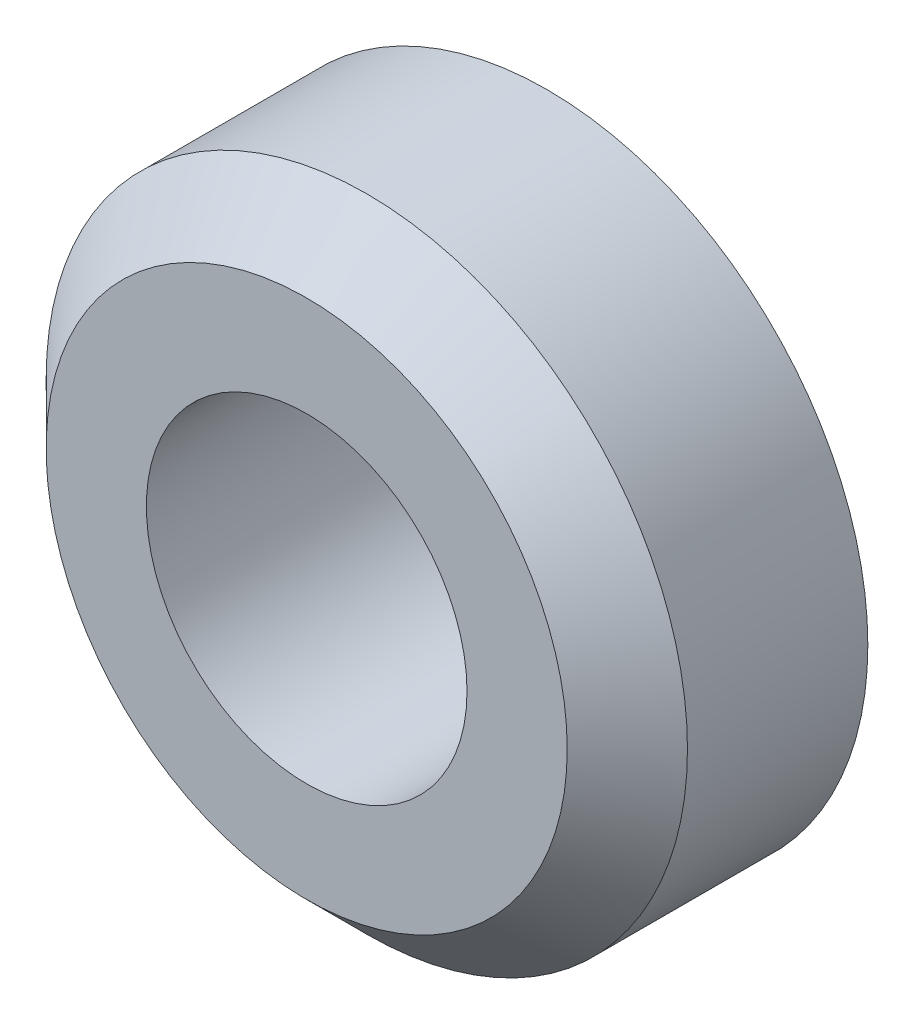
ISO-10303-21;
HEADER;
FILE_DESCRIPTION(('STEP AP214'),'2;1');
FILE_NAME('part.step','',(''),(''),'','','');
FILE_SCHEMA(('AUTOMOTIVE_DESIGN { 1 0 10303 214 1 1 1 1 }'));
ENDSEC;
DATA;
#1=APPLICATION_CONTEXT('core data for automotive mechanical design processes');
#2=APPLICATION_PROTOCOL_DEFINITION('international standard','automotive_design',2000,#1);
#3=PRODUCT_CONTEXT('',#1,'mechanical');
#4=PRODUCT('Part','Part','',(#3));
#5=PRODUCT_RELATED_PRODUCT_CATEGORY('part','',(#4));
#6=PRODUCT_DEFINITION_FORMATION('','',#4);
#7=PRODUCT_DEFINITION_CONTEXT('part definition',#1,'design');
#8=PRODUCT_DEFINITION('design','',#6,#7);
#9=PRODUCT_DEFINITION_SHAPE('','',#8);
#10=(LENGTH_UNIT() NAMED_UNIT(*) SI_UNIT(.MILLI.,.METRE.));
#11=(NAMED_UNIT(*) PLANE_ANGLE_UNIT() SI_UNIT($,.RADIAN.));
#12=(NAMED_UNIT(*) SI_UNIT($,.STERADIAN.) SOLID_ANGLE_UNIT());
#13=UNCERTAINTY_MEASURE_WITH_UNIT(LENGTH_MEASURE(1.E-05),#10,'distance_accuracy_value','');
#14=(GEOMETRIC_REPRESENTATION_CONTEXT(3) GLOBAL_UNCERTAINTY_ASSIGNED_CONTEXT((#13)) GLOBAL_UNIT_ASSIGNED_CONTEXT((#10,
#11,#12)) REPRESENTATION_CONTEXT('',''));
#15=CARTESIAN_POINT('',(0.,0.,0.));
#16=DIRECTION('',(0.,0.,1.));
#17=DIRECTION('',(1.,0.,0.));
#18=AXIS2_PLACEMENT_3D('',#15,#16,#17);
#19=CARTESIAN_POINT('',(0.,0.,6.));
#20=DIRECTION('',(0.,0.,1.));
#21=DIRECTION('',(1.,0.,0.));
#22=AXIS2_PLACEMENT_3D('',#19,#20,#21);
#23=PLANE('',#22);
#24=CARTESIAN_POINT('',(0.,0.,6.));
#25=DIRECTION('',(0.,0.,1.));
#26=DIRECTION('',(1.,0.,0.));
#27=AXIS2_PLACEMENT_3D('',#24,#25,#26);
#28=CIRCLE('',#27,6.5);
#29=CARTESIAN_POINT('',(6.5,0.,6.));
#30=VERTEX_POINT('',#29);
#31=EDGE_CURVE('E37',#30,#30,#28,.T.);
#32=ORIENTED_EDGE('',*,*,#31,.T.);
#33=EDGE_LOOP('',(#32));
#34=FACE_BOUND('',#33,.T.);
#35=CARTESIAN_POINT('',(0.,0.,6.));
#36=DIRECTION('',(0.,0.,1.));
#37=DIRECTION('',(1.,0.,0.));
#38=AXIS2_PLACEMENT_3D('',#35,#36,#37);
#39=CIRCLE('',#38,4.);
#40=CARTESIAN_POINT('',(4.,0.,6.));
#41=VERTEX_POINT('',#40);
#42=EDGE_CURVE('E45',#41,#41,#39,.T.);
#43=ORIENTED_EDGE('',*,*,#42,.F.);
#44=EDGE_LOOP('',(#43));
#45=FACE_BOUND('',#44,.T.);
#46=ADVANCED_FACE('F30',(#34,#45),#23,.T.);
#47=CARTESIAN_POINT('',(0.,0.,0.));
#48=DIRECTION('',(0.,0.,1.));
#49=DIRECTION('',(1.,0.,0.));
#50=AXIS2_PLACEMENT_3D('',#47,#48,#49);
#51=PLANE('',#50);
#52=CARTESIAN_POINT('',(0.,0.,0.));
#53=DIRECTION('',(0.,0.,1.));
#54=DIRECTION('',(1.,0.,0.));
#55=AXIS2_PLACEMENT_3D('',#52,#53,#54);
#56=CIRCLE('',#55,8.);
#57=CARTESIAN_POINT('',(8.,0.,0.));
#58=VERTEX_POINT('',#57);
#59=EDGE_CURVE('E41',#58,#58,#56,.T.);
#60=ORIENTED_EDGE('',*,*,#59,.F.);
#61=EDGE_LOOP('',(#60));
#62=FACE_BOUND('',#61,.T.);
#63=CARTESIAN_POINT('',(0.,0.,0.));
#64=DIRECTION('',(0.,0.,1.));
#65=DIRECTION('',(1.,0.,0.));
#66=AXIS2_PLACEMENT_3D('',#63,#64,#65);
#67=CIRCLE('',#66,4.);
#68=CARTESIAN_POINT('',(4.,0.,0.));
#69=VERTEX_POINT('',#68);
#70=EDGE_CURVE('E48',#69,#69,#67,.T.);
#71=ORIENTED_EDGE('',*,*,#70,.T.);
#72=EDGE_LOOP('',(#71));
#73=FACE_BOUND('',#72,.T.);
#74=ADVANCED_FACE('F58',(#62,#73),#51,.F.);
#75=CARTESIAN_POINT('',(0.,0.,6.));
#76=DIRECTION('',(0.,0.,-1.));
#77=DIRECTION('',(-1.,0.,0.));
#78=AXIS2_PLACEMENT_3D('',#75,#76,#77);
#79=CYLINDRICAL_SURFACE('',#78,8.);
#80=CARTESIAN_POINT('',(0.,0.,4.5));
#81=DIRECTION('',(0.,0.,1.));
#82=DIRECTION('',(1.,0.,0.));
#83=AXIS2_PLACEMENT_3D('',#80,#81,#82);
#84=CIRCLE('',#83,8.);
#85=CARTESIAN_POINT('',(8.,0.,4.5));
#86=VERTEX_POINT('',#85);
#87=EDGE_CURVE('E10',#86,#86,#84,.F.);
#88=ORIENTED_EDGE('',*,*,#87,.T.);
#89=EDGE_LOOP('',(#88));
#90=FACE_BOUND('',#89,.T.);
#91=ORIENTED_EDGE('',*,*,#59,.T.);
#92=EDGE_LOOP('',(#91));
#93=FACE_BOUND('',#92,.T.);
#94=ADVANCED_FACE('F63',(#90,#93),#79,.T.);
#95=CARTESIAN_POINT('',(0.,0.,6.));
#96=DIRECTION('',(0.,0.,-1.));
#97=DIRECTION('',(-1.,0.,0.));
#98=AXIS2_PLACEMENT_3D('',#95,#96,#97);
#99=CYLINDRICAL_SURFACE('',#98,4.);
#100=ORIENTED_EDGE('',*,*,#42,.T.);
#101=EDGE_LOOP('',(#100));
#102=FACE_BOUND('',#101,.T.);
#103=ORIENTED_EDGE('',*,*,#70,.F.);
#104=EDGE_LOOP('',(#103));
#105=FACE_BOUND('',#104,.T.);
#106=ADVANCED_FACE('F54',(#102,#105),#99,.F.);
#107=CARTESIAN_POINT('',(0.,0.,6.));
#108=DIRECTION('',(0.,0.,-1.));
#109=DIRECTION('',(-1.,0.,0.));
#110=AXIS2_PLACEMENT_3D('',#107,#108,#109);
#111=CONICAL_SURFACE('',#110,6.5,0.785398163397447);
#112=ORIENTED_EDGE('',*,*,#87,.F.);
#113=EDGE_LOOP('',(#112));
#114=FACE_BOUND('',#113,.T.);
#115=ORIENTED_EDGE('',*,*,#31,.F.);
#116=EDGE_LOOP('',(#115));
#117=FACE_BOUND('',#116,.T.);
#118=ADVANCED_FACE('F32',(#114,#117),#111,.T.);
#119=CLOSED_SHELL('',(#46,#74,#94,#106,#118));
#120=MANIFOLD_SOLID_BREP('B2',#119);
#121=ADVANCED_BREP_SHAPE_REPRESENTATION('',(#18,#120),#14);
#122=SHAPE_DEFINITION_REPRESENTATION(#9,#121);
ENDSEC;
END-ISO-10303-21;
